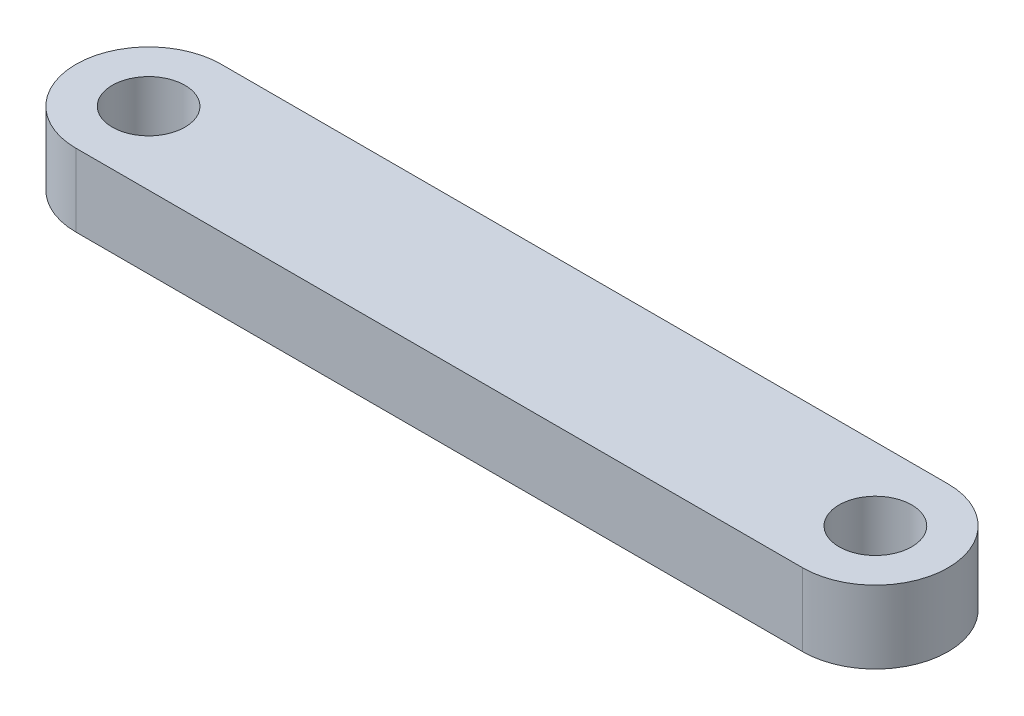
ISO-10303-21;
HEADER;
FILE_DESCRIPTION(('STEP AP214'),'2;1');
FILE_NAME('part.step','',(''),(''),'','','');
FILE_SCHEMA(('AUTOMOTIVE_DESIGN { 1 0 10303 214 1 1 1 1 }'));
ENDSEC;
DATA;
#1=APPLICATION_CONTEXT('core data for automotive mechanical design processes');
#2=APPLICATION_PROTOCOL_DEFINITION('international standard','automotive_design',2000,#1);
#3=PRODUCT_CONTEXT('',#1,'mechanical');
#4=PRODUCT('Part','Part','',(#3));
#5=PRODUCT_RELATED_PRODUCT_CATEGORY('part','',(#4));
#6=PRODUCT_DEFINITION_FORMATION('','',#4);
#7=PRODUCT_DEFINITION_CONTEXT('part definition',#1,'design');
#8=PRODUCT_DEFINITION('design','',#6,#7);
#9=PRODUCT_DEFINITION_SHAPE('','',#8);
#10=(LENGTH_UNIT() NAMED_UNIT(*) SI_UNIT(.MILLI.,.METRE.));
#11=(NAMED_UNIT(*) PLANE_ANGLE_UNIT() SI_UNIT($,.RADIAN.));
#12=(NAMED_UNIT(*) SI_UNIT($,.STERADIAN.) SOLID_ANGLE_UNIT());
#13=UNCERTAINTY_MEASURE_WITH_UNIT(LENGTH_MEASURE(1.E-05),#10,'distance_accuracy_value','');
#14=(GEOMETRIC_REPRESENTATION_CONTEXT(3) GLOBAL_UNCERTAINTY_ASSIGNED_CONTEXT((#13)) GLOBAL_UNIT_ASSIGNED_CONTEXT((#10,
#11,#12)) REPRESENTATION_CONTEXT('',''));
#15=CARTESIAN_POINT('',(0.,0.,0.));
#16=DIRECTION('',(0.,0.,1.));
#17=DIRECTION('',(1.,0.,0.));
#18=AXIS2_PLACEMENT_3D('',#15,#16,#17);
#19=CARTESIAN_POINT('',(-500.,50.,0.));
#20=DIRECTION('',(0.,1.,0.));
#21=DIRECTION('',(0.,0.,1.));
#22=AXIS2_PLACEMENT_3D('',#19,#20,#21);
#23=PLANE('',#22);
#24=CARTESIAN_POINT('',(-500.,50.,0.));
#25=DIRECTION('',(0.,1.,0.));
#26=DIRECTION('',(0.,0.,1.));
#27=AXIS2_PLACEMENT_3D('',#24,#25,#26);
#28=CIRCLE('',#27,50.);
#29=CARTESIAN_POINT('',(-500.,50.,50.));
#30=VERTEX_POINT('',#29);
#31=EDGE_CURVE('E118',#30,#30,#28,.T.);
#32=ORIENTED_EDGE('',*,*,#31,.F.);
#33=EDGE_LOOP('',(#32));
#34=FACE_BOUND('',#33,.T.);
#35=CARTESIAN_POINT('',(-500.,50.,0.));
#36=DIRECTION('',(0.,1.,0.));
#37=DIRECTION('',(0.,0.,1.));
#38=AXIS2_PLACEMENT_3D('',#35,#36,#37);
#39=CIRCLE('',#38,100.);
#40=CARTESIAN_POINT('',(-500.,50.,-100.));
#41=VERTEX_POINT('',#40);
#42=CARTESIAN_POINT('',(-500.,50.,100.));
#43=VERTEX_POINT('',#42);
#44=EDGE_CURVE('E98',#41,#43,#39,.T.);
#45=ORIENTED_EDGE('',*,*,#44,.T.);
#46=DIRECTION('',(1.,0.,0.));
#47=VECTOR('',#46,1.);
#48=CARTESIAN_POINT('',(-500.,50.,100.));
#49=LINE('',#48,#47);
#50=CARTESIAN_POINT('',(500.,50.,99.9999999999998));
#51=VERTEX_POINT('',#50);
#52=EDGE_CURVE('E93',#43,#51,#49,.T.);
#53=ORIENTED_EDGE('',*,*,#52,.T.);
#54=CARTESIAN_POINT('',(500.,50.,-1.83697019872103E-13));
#55=DIRECTION('',(0.,1.,0.));
#56=DIRECTION('',(0.,0.,1.));
#57=AXIS2_PLACEMENT_3D('',#54,#55,#56);
#58=CIRCLE('',#57,100.);
#59=CARTESIAN_POINT('',(500.,50.,-100.));
#60=VERTEX_POINT('',#59);
#61=EDGE_CURVE('E96',#51,#60,#58,.T.);
#62=ORIENTED_EDGE('',*,*,#61,.T.);
#63=DIRECTION('',(-1.,0.,0.));
#64=VECTOR('',#63,1.);
#65=CARTESIAN_POINT('',(-500.,50.,-100.));
#66=LINE('',#65,#64);
#67=EDGE_CURVE('E63',#60,#41,#66,.T.);
#68=ORIENTED_EDGE('',*,*,#67,.T.);
#69=EDGE_LOOP('',(#45,#53,#62,#68));
#70=FACE_BOUND('',#69,.T.);
#71=CARTESIAN_POINT('',(500.,50.,-1.83697019872103E-13));
#72=DIRECTION('',(0.,1.,0.));
#73=DIRECTION('',(0.,0.,1.));
#74=AXIS2_PLACEMENT_3D('',#71,#72,#73);
#75=CIRCLE('',#74,50.);
#76=CARTESIAN_POINT('',(500.,50.,49.9999999999998));
#77=VERTEX_POINT('',#76);
#78=EDGE_CURVE('E140',#77,#77,#75,.T.);
#79=ORIENTED_EDGE('',*,*,#78,.F.);
#80=EDGE_LOOP('',(#79));
#81=FACE_BOUND('',#80,.T.);
#82=ADVANCED_FACE('F45',(#34,#70,#81),#23,.T.);
#83=CARTESIAN_POINT('',(-500.,-50.,0.));
#84=DIRECTION('',(0.,1.,0.));
#85=DIRECTION('',(0.,0.,1.));
#86=AXIS2_PLACEMENT_3D('',#83,#84,#85);
#87=PLANE('',#86);
#88=CARTESIAN_POINT('',(-500.,-50.,0.));
#89=DIRECTION('',(0.,1.,0.));
#90=DIRECTION('',(0.,0.,1.));
#91=AXIS2_PLACEMENT_3D('',#88,#89,#90);
#92=CIRCLE('',#91,100.);
#93=CARTESIAN_POINT('',(-500.,-50.,-100.));
#94=VERTEX_POINT('',#93);
#95=CARTESIAN_POINT('',(-500.,-50.,100.));
#96=VERTEX_POINT('',#95);
#97=EDGE_CURVE('E115',#94,#96,#92,.T.);
#98=ORIENTED_EDGE('',*,*,#97,.F.);
#99=DIRECTION('',(-1.,0.,0.));
#100=VECTOR('',#99,1.);
#101=CARTESIAN_POINT('',(-500.,-50.,-100.));
#102=LINE('',#101,#100);
#103=CARTESIAN_POINT('',(500.,-50.,-100.));
#104=VERTEX_POINT('',#103);
#105=EDGE_CURVE('E86',#104,#94,#102,.T.);
#106=ORIENTED_EDGE('',*,*,#105,.F.);
#107=CARTESIAN_POINT('',(500.,-50.,-1.83697019872103E-13));
#108=DIRECTION('',(0.,1.,0.));
#109=DIRECTION('',(0.,0.,1.));
#110=AXIS2_PLACEMENT_3D('',#107,#108,#109);
#111=CIRCLE('',#110,100.);
#112=CARTESIAN_POINT('',(500.,-50.,99.9999999999998));
#113=VERTEX_POINT('',#112);
#114=EDGE_CURVE('E80',#113,#104,#111,.T.);
#115=ORIENTED_EDGE('',*,*,#114,.F.);
#116=DIRECTION('',(1.,0.,0.));
#117=VECTOR('',#116,1.);
#118=CARTESIAN_POINT('',(-500.,-50.,100.));
#119=LINE('',#118,#117);
#120=EDGE_CURVE('E103',#96,#113,#119,.T.);
#121=ORIENTED_EDGE('',*,*,#120,.F.);
#122=EDGE_LOOP('',(#98,#106,#115,#121));
#123=FACE_BOUND('',#122,.T.);
#124=CARTESIAN_POINT('',(-500.,-50.,0.));
#125=DIRECTION('',(0.,1.,0.));
#126=DIRECTION('',(0.,0.,1.));
#127=AXIS2_PLACEMENT_3D('',#124,#125,#126);
#128=CIRCLE('',#127,50.);
#129=CARTESIAN_POINT('',(-500.,-50.,50.));
#130=VERTEX_POINT('',#129);
#131=EDGE_CURVE('E137',#130,#130,#128,.T.);
#132=ORIENTED_EDGE('',*,*,#131,.T.);
#133=EDGE_LOOP('',(#132));
#134=FACE_BOUND('',#133,.T.);
#135=CARTESIAN_POINT('',(500.,-50.,-1.83697019872103E-13));
#136=DIRECTION('',(0.,1.,0.));
#137=DIRECTION('',(0.,0.,1.));
#138=AXIS2_PLACEMENT_3D('',#135,#136,#137);
#139=CIRCLE('',#138,50.);
#140=CARTESIAN_POINT('',(500.,-50.,49.9999999999998));
#141=VERTEX_POINT('',#140);
#142=EDGE_CURVE('E144',#141,#141,#139,.T.);
#143=ORIENTED_EDGE('',*,*,#142,.T.);
#144=EDGE_LOOP('',(#143));
#145=FACE_BOUND('',#144,.T.);
#146=ADVANCED_FACE('F132',(#123,#134,#145),#87,.F.);
#147=CARTESIAN_POINT('',(-500.,50.,0.));
#148=DIRECTION('',(0.,-1.,0.));
#149=DIRECTION('',(0.,0.,-1.));
#150=AXIS2_PLACEMENT_3D('',#147,#148,#149);
#151=CYLINDRICAL_SURFACE('',#150,100.);
#152=ORIENTED_EDGE('',*,*,#97,.T.);
#153=DIRECTION('',(0.,-1.,0.));
#154=VECTOR('',#153,1.);
#155=CARTESIAN_POINT('',(-500.,50.,100.));
#156=LINE('',#155,#154);
#157=EDGE_CURVE('E11',#43,#96,#156,.T.);
#158=ORIENTED_EDGE('',*,*,#157,.F.);
#159=ORIENTED_EDGE('',*,*,#44,.F.);
#160=DIRECTION('',(0.,-1.,0.));
#161=VECTOR('',#160,1.);
#162=CARTESIAN_POINT('',(-500.,50.,-100.));
#163=LINE('',#162,#161);
#164=EDGE_CURVE('E111',#41,#94,#163,.T.);
#165=ORIENTED_EDGE('',*,*,#164,.T.);
#166=EDGE_LOOP('',(#152,#158,#159,#165));
#167=FACE_BOUND('',#166,.T.);
#168=ADVANCED_FACE('F47',(#167),#151,.T.);
#169=CARTESIAN_POINT('',(-500.,50.,100.));
#170=DIRECTION('',(0.,0.,-1.));
#171=DIRECTION('',(-1.,0.,0.));
#172=AXIS2_PLACEMENT_3D('',#169,#170,#171);
#173=PLANE('',#172);
#174=ORIENTED_EDGE('',*,*,#120,.T.);
#175=DIRECTION('',(0.,-1.,0.));
#176=VECTOR('',#175,1.);
#177=CARTESIAN_POINT('',(500.,50.,99.9999999999998));
#178=LINE('',#177,#176);
#179=EDGE_CURVE('E55',#51,#113,#178,.T.);
#180=ORIENTED_EDGE('',*,*,#179,.F.);
#181=ORIENTED_EDGE('',*,*,#52,.F.);
#182=ORIENTED_EDGE('',*,*,#157,.T.);
#183=EDGE_LOOP('',(#174,#180,#181,#182));
#184=FACE_BOUND('',#183,.T.);
#185=ADVANCED_FACE('F102',(#184),#173,.F.);
#186=CARTESIAN_POINT('',(500.,50.,-1.83697019872103E-13));
#187=DIRECTION('',(0.,-1.,0.));
#188=DIRECTION('',(0.,0.,-1.));
#189=AXIS2_PLACEMENT_3D('',#186,#187,#188);
#190=CYLINDRICAL_SURFACE('',#189,100.);
#191=ORIENTED_EDGE('',*,*,#114,.T.);
#192=DIRECTION('',(0.,-1.,0.));
#193=VECTOR('',#192,1.);
#194=CARTESIAN_POINT('',(500.,50.,-100.));
#195=LINE('',#194,#193);
#196=EDGE_CURVE('E105',#60,#104,#195,.T.);
#197=ORIENTED_EDGE('',*,*,#196,.F.);
#198=ORIENTED_EDGE('',*,*,#61,.F.);
#199=ORIENTED_EDGE('',*,*,#179,.T.);
#200=EDGE_LOOP('',(#191,#197,#198,#199));
#201=FACE_BOUND('',#200,.T.);
#202=ADVANCED_FACE('F106',(#201),#190,.T.);
#203=CARTESIAN_POINT('',(-500.,50.,-100.));
#204=DIRECTION('',(0.,0.,1.));
#205=DIRECTION('',(1.,0.,0.));
#206=AXIS2_PLACEMENT_3D('',#203,#204,#205);
#207=PLANE('',#206);
#208=ORIENTED_EDGE('',*,*,#105,.T.);
#209=ORIENTED_EDGE('',*,*,#164,.F.);
#210=ORIENTED_EDGE('',*,*,#67,.F.);
#211=ORIENTED_EDGE('',*,*,#196,.T.);
#212=EDGE_LOOP('',(#208,#209,#210,#211));
#213=FACE_BOUND('',#212,.T.);
#214=ADVANCED_FACE('F129',(#213),#207,.F.);
#215=CARTESIAN_POINT('',(-500.,50.,0.));
#216=DIRECTION('',(0.,-1.,0.));
#217=DIRECTION('',(0.,0.,-1.));
#218=AXIS2_PLACEMENT_3D('',#215,#216,#217);
#219=CYLINDRICAL_SURFACE('',#218,50.);
#220=ORIENTED_EDGE('',*,*,#31,.T.);
#221=EDGE_LOOP('',(#220));
#222=FACE_BOUND('',#221,.T.);
#223=ORIENTED_EDGE('',*,*,#131,.F.);
#224=EDGE_LOOP('',(#223));
#225=FACE_BOUND('',#224,.T.);
#226=ADVANCED_FACE('F163',(#222,#225),#219,.F.);
#227=CARTESIAN_POINT('',(500.,50.,-1.83697019872103E-13));
#228=DIRECTION('',(0.,-1.,0.));
#229=DIRECTION('',(0.,0.,-1.));
#230=AXIS2_PLACEMENT_3D('',#227,#228,#229);
#231=CYLINDRICAL_SURFACE('',#230,50.);
#232=ORIENTED_EDGE('',*,*,#78,.T.);
#233=EDGE_LOOP('',(#232));
#234=FACE_BOUND('',#233,.T.);
#235=ORIENTED_EDGE('',*,*,#142,.F.);
#236=EDGE_LOOP('',(#235));
#237=FACE_BOUND('',#236,.T.);
#238=ADVANCED_FACE('F152',(#234,#237),#231,.F.);
#239=CLOSED_SHELL('',(#82,#146,#168,#185,#202,#214,#226,#238));
#240=MANIFOLD_SOLID_BREP('B2',#239);
#241=ADVANCED_BREP_SHAPE_REPRESENTATION('',(#18,#240),#14);
#242=SHAPE_DEFINITION_REPRESENTATION(#9,#241);
ENDSEC;
END-ISO-10303-21;
